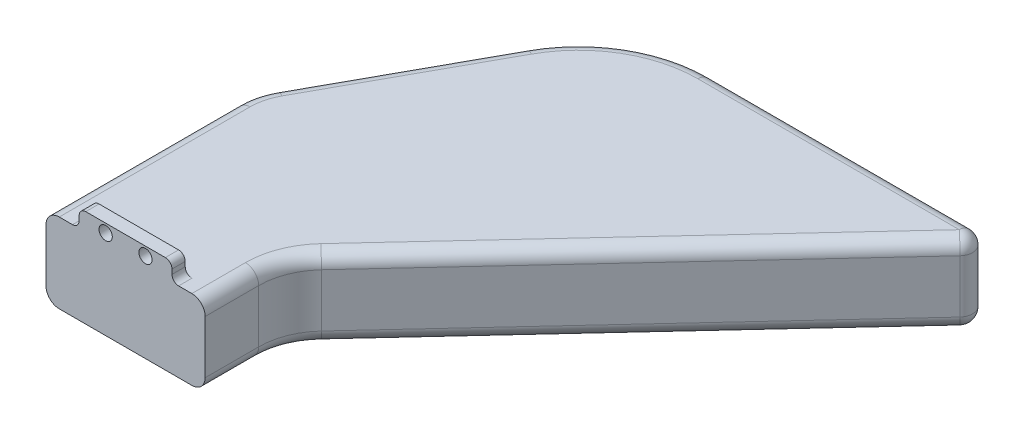
ISO-10303-21;
HEADER;
FILE_DESCRIPTION(('STEP AP214'),'2;1');
FILE_NAME('part.step','',(''),(''),'','','');
FILE_SCHEMA(('AUTOMOTIVE_DESIGN { 1 0 10303 214 1 1 1 1 }'));
ENDSEC;
DATA;
#1=APPLICATION_CONTEXT('core data for automotive mechanical design processes');
#2=APPLICATION_PROTOCOL_DEFINITION('international standard','automotive_design',2000,#1);
#3=PRODUCT_CONTEXT('',#1,'mechanical');
#4=PRODUCT('Part','Part','',(#3));
#5=PRODUCT_RELATED_PRODUCT_CATEGORY('part','',(#4));
#6=PRODUCT_DEFINITION_FORMATION('','',#4);
#7=PRODUCT_DEFINITION_CONTEXT('part definition',#1,'design');
#8=PRODUCT_DEFINITION('design','',#6,#7);
#9=PRODUCT_DEFINITION_SHAPE('','',#8);
#10=(LENGTH_UNIT() NAMED_UNIT(*) SI_UNIT(.MILLI.,.METRE.));
#11=(NAMED_UNIT(*) PLANE_ANGLE_UNIT() SI_UNIT($,.RADIAN.));
#12=(NAMED_UNIT(*) SI_UNIT($,.STERADIAN.) SOLID_ANGLE_UNIT());
#13=UNCERTAINTY_MEASURE_WITH_UNIT(LENGTH_MEASURE(1.E-05),#10,'distance_accuracy_value','');
#14=(GEOMETRIC_REPRESENTATION_CONTEXT(3) GLOBAL_UNCERTAINTY_ASSIGNED_CONTEXT((#13)) GLOBAL_UNIT_ASSIGNED_CONTEXT((#10,
#11,#12)) REPRESENTATION_CONTEXT('',''));
#15=CARTESIAN_POINT('',(0.,0.,0.));
#16=DIRECTION('',(0.,0.,1.));
#17=DIRECTION('',(1.,0.,0.));
#18=AXIS2_PLACEMENT_3D('',#15,#16,#17);
#19=CARTESIAN_POINT('',(4.05099434095391,6.,-18.1082033154485));
#20=DIRECTION('',(0.,-1.,0.));
#21=DIRECTION('',(0.,0.,-1.));
#22=AXIS2_PLACEMENT_3D('',#19,#20,#21);
#23=CYLINDRICAL_SURFACE('',#22,10.);
#24=DIRECTION('',(0.,-1.,0.));
#25=VECTOR('',#24,1.);
#26=CARTESIAN_POINT('',(4.05099434095391,6.,-28.1082033154485));
#27=LINE('',#26,#25);
#28=CARTESIAN_POINT('',(4.05099434095391,5.,-28.1082033154485));
#29=VERTEX_POINT('',#28);
#30=CARTESIAN_POINT('',(4.05099434095391,1.,-28.1082033154485));
#31=VERTEX_POINT('',#30);
#32=EDGE_CURVE('E229',#29,#31,#27,.T.);
#33=ORIENTED_EDGE('',*,*,#32,.T.);
#34=CARTESIAN_POINT('',(4.05099434095391,1.,-18.1082033154485));
#35=DIRECTION('',(0.,1.,0.));
#36=DIRECTION('',(0.,0.,1.));
#37=AXIS2_PLACEMENT_3D('',#34,#35,#36);
#38=CIRCLE('',#37,10.);
#39=CARTESIAN_POINT('',(-4.71242206550166,1.,-22.9251040708166));
#40=VERTEX_POINT('',#39);
#41=EDGE_CURVE('E304',#31,#40,#38,.T.);
#42=ORIENTED_EDGE('',*,*,#41,.T.);
#43=DIRECTION('',(0.,-1.,0.));
#44=VECTOR('',#43,1.);
#45=CARTESIAN_POINT('',(-4.71242206550166,6.,-22.9251040708166));
#46=LINE('',#45,#44);
#47=CARTESIAN_POINT('',(-4.71242206550166,5.,-22.9251040708166));
#48=VERTEX_POINT('',#47);
#49=EDGE_CURVE('E219',#48,#40,#46,.T.);
#50=ORIENTED_EDGE('',*,*,#49,.F.);
#51=CARTESIAN_POINT('',(4.05099434095391,5.,-18.1082033154485));
#52=DIRECTION('',(0.,1.,0.));
#53=DIRECTION('',(0.,0.,1.));
#54=AXIS2_PLACEMENT_3D('',#51,#52,#53);
#55=CIRCLE('',#54,10.);
#56=EDGE_CURVE('E252',#48,#29,#55,.F.);
#57=ORIENTED_EDGE('',*,*,#56,.T.);
#58=EDGE_LOOP('',(#33,#42,#50,#57));
#59=FACE_BOUND('',#58,.T.);
#60=ADVANCED_FACE('F33',(#59),#23,.T.);
#61=CARTESIAN_POINT('',(-11.3817082032278,6.,-10.7916318389956));
#62=DIRECTION('',(0.876341640645557,0.,0.481690075536806));
#63=DIRECTION('',(0.481690075536806,0.,-0.876341640645557));
#64=AXIS2_PLACEMENT_3D('',#61,#62,#63);
#65=PLANE('',#64);
#66=ORIENTED_EDGE('',*,*,#49,.T.);
#67=DIRECTION('',(-0.481690075536806,0.,0.876341640645557));
#68=VECTOR('',#67,1.);
#69=CARTESIAN_POINT('',(-11.3817082032278,1.,-10.7916318389956));
#70=LINE('',#69,#68);
#71=CARTESIAN_POINT('',(-11.3817082032278,1.,-10.7916318389956));
#72=VERTEX_POINT('',#71);
#73=EDGE_CURVE('E302',#40,#72,#70,.T.);
#74=ORIENTED_EDGE('',*,*,#73,.T.);
#75=DIRECTION('',(0.,-1.,0.));
#76=VECTOR('',#75,1.);
#77=CARTESIAN_POINT('',(-11.3817082032278,6.,-10.7916318389956));
#78=LINE('',#77,#76);
#79=CARTESIAN_POINT('',(-11.3817082032278,5.,-10.7916318389956));
#80=VERTEX_POINT('',#79);
#81=EDGE_CURVE('E432',#80,#72,#78,.T.);
#82=ORIENTED_EDGE('',*,*,#81,.F.);
#83=DIRECTION('',(-0.481690075536806,0.,0.876341640645557));
#84=VECTOR('',#83,1.);
#85=CARTESIAN_POINT('',(-4.71242206550166,5.,-22.9251040708166));
#86=LINE('',#85,#84);
#87=EDGE_CURVE('E254',#80,#48,#86,.F.);
#88=ORIENTED_EDGE('',*,*,#87,.T.);
#89=EDGE_LOOP('',(#66,#74,#82,#88));
#90=FACE_BOUND('',#89,.T.);
#91=ADVANCED_FACE('F515',(#90),#65,.F.);
#92=CARTESIAN_POINT('',(-7.,6.,-8.38318146131155));
#93=DIRECTION('',(0.,-1.,0.));
#94=DIRECTION('',(0.,0.,-1.));
#95=AXIS2_PLACEMENT_3D('',#92,#93,#94);
#96=CYLINDRICAL_SURFACE('',#95,5.);
#97=ORIENTED_EDGE('',*,*,#81,.T.);
#98=CARTESIAN_POINT('',(-7.,1.,-8.38318146131155));
#99=DIRECTION('',(0.,1.,0.));
#100=DIRECTION('',(0.,0.,1.));
#101=AXIS2_PLACEMENT_3D('',#98,#99,#100);
#102=CIRCLE('',#101,5.);
#103=CARTESIAN_POINT('',(-12.,1.,-8.38318146131155));
#104=VERTEX_POINT('',#103);
#105=EDGE_CURVE('E259',#72,#104,#102,.T.);
#106=ORIENTED_EDGE('',*,*,#105,.T.);
#107=DIRECTION('',(0.,-1.,0.));
#108=VECTOR('',#107,1.);
#109=CARTESIAN_POINT('',(-12.,6.,-8.38318146131155));
#110=LINE('',#109,#108);
#111=CARTESIAN_POINT('',(-12.,5.,-8.38318146131155));
#112=VERTEX_POINT('',#111);
#113=EDGE_CURVE('E429',#112,#104,#110,.T.);
#114=ORIENTED_EDGE('',*,*,#113,.F.);
#115=CARTESIAN_POINT('',(-7.,5.,-8.38318146131155));
#116=DIRECTION('',(0.,1.,0.));
#117=DIRECTION('',(0.,0.,1.));
#118=AXIS2_PLACEMENT_3D('',#115,#116,#117);
#119=CIRCLE('',#118,5.);
#120=EDGE_CURVE('E256',#112,#80,#119,.F.);
#121=ORIENTED_EDGE('',*,*,#120,.T.);
#122=EDGE_LOOP('',(#97,#106,#114,#121));
#123=FACE_BOUND('',#122,.T.);
#124=ADVANCED_FACE('F512',(#123),#96,.T.);
#125=CARTESIAN_POINT('',(-12.,6.,-8.38318146131155));
#126=DIRECTION('',(1.,0.,0.));
#127=DIRECTION('',(0.,0.,-1.));
#128=AXIS2_PLACEMENT_3D('',#125,#126,#127);
#129=PLANE('',#128);
#130=ORIENTED_EDGE('',*,*,#113,.T.);
#131=DIRECTION('',(0.,0.,1.));
#132=VECTOR('',#131,1.);
#133=CARTESIAN_POINT('',(-12.,1.,-8.38318146131155));
#134=LINE('',#133,#132);
#135=CARTESIAN_POINT('',(-12.,1.,6.));
#136=VERTEX_POINT('',#135);
#137=EDGE_CURVE('E314',#104,#136,#134,.T.);
#138=ORIENTED_EDGE('',*,*,#137,.T.);
#139=DIRECTION('',(0.,-1.,0.));
#140=VECTOR('',#139,1.);
#141=CARTESIAN_POINT('',(-12.,6.,6.));
#142=LINE('',#141,#140);
#143=CARTESIAN_POINT('',(-12.,5.,6.));
#144=VERTEX_POINT('',#143);
#145=EDGE_CURVE('E427',#144,#136,#142,.T.);
#146=ORIENTED_EDGE('',*,*,#145,.F.);
#147=DIRECTION('',(0.,0.,1.));
#148=VECTOR('',#147,1.);
#149=CARTESIAN_POINT('',(-12.,5.,-8.38318146131155));
#150=LINE('',#149,#148);
#151=EDGE_CURVE('E234',#144,#112,#150,.F.);
#152=ORIENTED_EDGE('',*,*,#151,.T.);
#153=EDGE_LOOP('',(#130,#138,#146,#152));
#154=FACE_BOUND('',#153,.T.);
#155=ADVANCED_FACE('F529',(#154),#129,.F.);
#156=CARTESIAN_POINT('',(-12.,6.,6.));
#157=DIRECTION('',(0.,0.,-1.));
#158=DIRECTION('',(-1.,0.,0.));
#159=AXIS2_PLACEMENT_3D('',#156,#157,#158);
#160=PLANE('',#159);
#161=CARTESIAN_POINT('',(-4.5,6.7,6.));
#162=DIRECTION('',(0.,0.,-1.));
#163=DIRECTION('',(1.,0.,0.));
#164=AXIS2_PLACEMENT_3D('',#161,#162,#163);
#165=CIRCLE('',#164,0.500000000000002);
#166=CARTESIAN_POINT('',(-4.,6.7,6.));
#167=VERTEX_POINT('',#166);
#168=EDGE_CURVE('E844',#167,#167,#165,.T.);
#169=ORIENTED_EDGE('',*,*,#168,.T.);
#170=EDGE_LOOP('',(#169));
#171=FACE_BOUND('',#170,.T.);
#172=CARTESIAN_POINT('',(-7.5,6.7,6.));
#173=DIRECTION('',(0.,0.,-1.));
#174=DIRECTION('',(-1.,0.,0.));
#175=AXIS2_PLACEMENT_3D('',#172,#173,#174);
#176=CIRCLE('',#175,0.500000000000003);
#177=CARTESIAN_POINT('',(-8.,6.7,6.));
#178=VERTEX_POINT('',#177);
#179=EDGE_CURVE('E387',#178,#178,#176,.T.);
#180=ORIENTED_EDGE('',*,*,#179,.T.);
#181=EDGE_LOOP('',(#180));
#182=FACE_BOUND('',#181,.T.);
#183=DIRECTION('',(-1.,0.,0.));
#184=VECTOR('',#183,1.);
#185=CARTESIAN_POINT('',(-9.5,7.35,6.));
#186=LINE('',#185,#184);
#187=CARTESIAN_POINT('',(-3.,7.35,6.));
#188=VERTEX_POINT('',#187);
#189=CARTESIAN_POINT('',(-9.,7.35,6.));
#190=VERTEX_POINT('',#189);
#191=EDGE_CURVE('E386',#188,#190,#186,.T.);
#192=ORIENTED_EDGE('',*,*,#191,.T.);
#193=CARTESIAN_POINT('',(-9.,6.85,6.));
#194=DIRECTION('',(0.,0.,-1.));
#195=DIRECTION('',(-1.,0.,0.));
#196=AXIS2_PLACEMENT_3D('',#193,#194,#195);
#197=CIRCLE('',#196,0.5);
#198=CARTESIAN_POINT('',(-9.5,6.85,6.));
#199=VERTEX_POINT('',#198);
#200=EDGE_CURVE('E352',#190,#199,#197,.F.);
#201=ORIENTED_EDGE('',*,*,#200,.T.);
#202=DIRECTION('',(0.,-1.,0.));
#203=VECTOR('',#202,1.);
#204=CARTESIAN_POINT('',(-9.5,6.,6.));
#205=LINE('',#204,#203);
#206=CARTESIAN_POINT('',(-9.5,6.5,6.));
#207=VERTEX_POINT('',#206);
#208=EDGE_CURVE('E400',#199,#207,#205,.T.);
#209=ORIENTED_EDGE('',*,*,#208,.T.);
#210=CARTESIAN_POINT('',(-10.,6.5,6.));
#211=DIRECTION('',(0.,0.,-1.));
#212=DIRECTION('',(-1.,0.,0.));
#213=AXIS2_PLACEMENT_3D('',#210,#211,#212);
#214=CIRCLE('',#213,0.5);
#215=CARTESIAN_POINT('',(-10.,6.,6.));
#216=VERTEX_POINT('',#215);
#217=EDGE_CURVE('E228',#207,#216,#214,.T.);
#218=ORIENTED_EDGE('',*,*,#217,.T.);
#219=DIRECTION('',(1.,0.,0.));
#220=VECTOR('',#219,1.);
#221=CARTESIAN_POINT('',(-12.,6.,6.));
#222=LINE('',#221,#220);
#223=CARTESIAN_POINT('',(-11.,6.,6.));
#224=VERTEX_POINT('',#223);
#225=EDGE_CURVE('E211',#224,#216,#222,.T.);
#226=ORIENTED_EDGE('',*,*,#225,.F.);
#227=CARTESIAN_POINT('',(-11.,5.,6.));
#228=DIRECTION('',(0.,0.,-1.));
#229=DIRECTION('',(-1.,0.,0.));
#230=AXIS2_PLACEMENT_3D('',#227,#228,#229);
#231=CIRCLE('',#230,1.);
#232=EDGE_CURVE('E225',#224,#144,#231,.F.);
#233=ORIENTED_EDGE('',*,*,#232,.T.);
#234=ORIENTED_EDGE('',*,*,#145,.T.);
#235=CARTESIAN_POINT('',(-11.,1.,6.));
#236=DIRECTION('',(0.,0.,-1.));
#237=DIRECTION('',(-1.,0.,0.));
#238=AXIS2_PLACEMENT_3D('',#235,#236,#237);
#239=CIRCLE('',#238,1.);
#240=CARTESIAN_POINT('',(-11.,0.,6.));
#241=VERTEX_POINT('',#240);
#242=EDGE_CURVE('E318',#136,#241,#239,.F.);
#243=ORIENTED_EDGE('',*,*,#242,.T.);
#244=DIRECTION('',(1.,0.,0.));
#245=VECTOR('',#244,1.);
#246=CARTESIAN_POINT('',(-12.,0.,6.));
#247=LINE('',#246,#245);
#248=CARTESIAN_POINT('',(-1.,0.,6.));
#249=VERTEX_POINT('',#248);
#250=EDGE_CURVE('E283',#241,#249,#247,.T.);
#251=ORIENTED_EDGE('',*,*,#250,.T.);
#252=CARTESIAN_POINT('',(-1.,1.,6.));
#253=DIRECTION('',(0.,0.,-1.));
#254=DIRECTION('',(-1.,0.,0.));
#255=AXIS2_PLACEMENT_3D('',#252,#253,#254);
#256=CIRCLE('',#255,1.);
#257=CARTESIAN_POINT('',(0.,1.,6.));
#258=VERTEX_POINT('',#257);
#259=EDGE_CURVE('E316',#249,#258,#256,.F.);
#260=ORIENTED_EDGE('',*,*,#259,.T.);
#261=DIRECTION('',(0.,-1.,0.));
#262=VECTOR('',#261,1.);
#263=CARTESIAN_POINT('',(0.,6.,6.));
#264=LINE('',#263,#262);
#265=CARTESIAN_POINT('',(0.,5.,6.));
#266=VERTEX_POINT('',#265);
#267=EDGE_CURVE('E424',#266,#258,#264,.T.);
#268=ORIENTED_EDGE('',*,*,#267,.F.);
#269=CARTESIAN_POINT('',(-1.,5.,6.));
#270=DIRECTION('',(0.,0.,-1.));
#271=DIRECTION('',(-1.,0.,0.));
#272=AXIS2_PLACEMENT_3D('',#269,#270,#271);
#273=CIRCLE('',#272,1.);
#274=CARTESIAN_POINT('',(-1.,6.,6.));
#275=VERTEX_POINT('',#274);
#276=EDGE_CURVE('E235',#266,#275,#273,.F.);
#277=ORIENTED_EDGE('',*,*,#276,.T.);
#278=CARTESIAN_POINT('',(-2.,6.,6.));
#279=VERTEX_POINT('',#278);
#280=EDGE_CURVE('E230',#279,#275,#222,.T.);
#281=ORIENTED_EDGE('',*,*,#280,.F.);
#282=CARTESIAN_POINT('',(-2.,6.5,6.));
#283=DIRECTION('',(0.,0.,-1.));
#284=DIRECTION('',(-1.,0.,0.));
#285=AXIS2_PLACEMENT_3D('',#282,#283,#284);
#286=CIRCLE('',#285,0.5);
#287=CARTESIAN_POINT('',(-2.5,6.5,6.));
#288=VERTEX_POINT('',#287);
#289=EDGE_CURVE('E41',#279,#288,#286,.T.);
#290=ORIENTED_EDGE('',*,*,#289,.T.);
#291=DIRECTION('',(0.,1.,0.));
#292=VECTOR('',#291,1.);
#293=CARTESIAN_POINT('',(-2.5,6.,6.));
#294=LINE('',#293,#292);
#295=CARTESIAN_POINT('',(-2.5,6.85,6.));
#296=VERTEX_POINT('',#295);
#297=EDGE_CURVE('E377',#288,#296,#294,.T.);
#298=ORIENTED_EDGE('',*,*,#297,.T.);
#299=CARTESIAN_POINT('',(-3.,6.85,6.));
#300=DIRECTION('',(0.,0.,-1.));
#301=DIRECTION('',(-1.,0.,0.));
#302=AXIS2_PLACEMENT_3D('',#299,#300,#301);
#303=CIRCLE('',#302,0.5);
#304=EDGE_CURVE('E350',#296,#188,#303,.F.);
#305=ORIENTED_EDGE('',*,*,#304,.T.);
#306=EDGE_LOOP('',(#192,#201,#209,#218,#226,#233,#234,#243,#251,#260,#268,#277,#281,#290,#298,#305));
#307=FACE_BOUND('',#306,.T.);
#308=ADVANCED_FACE('F223',(#171,#182,#307),#160,.F.);
#309=CARTESIAN_POINT('',(0.,6.,6.));
#310=DIRECTION('',(-1.,0.,0.));
#311=DIRECTION('',(0.,0.,1.));
#312=AXIS2_PLACEMENT_3D('',#309,#310,#311);
#313=PLANE('',#312);
#314=ORIENTED_EDGE('',*,*,#267,.T.);
#315=DIRECTION('',(0.,0.,-1.));
#316=VECTOR('',#315,1.);
#317=CARTESIAN_POINT('',(0.,1.,6.));
#318=LINE('',#317,#316);
#319=CARTESIAN_POINT('',(0.,1.,1.96099101723557));
#320=VERTEX_POINT('',#319);
#321=EDGE_CURVE('E320',#258,#320,#318,.T.);
#322=ORIENTED_EDGE('',*,*,#321,.T.);
#323=DIRECTION('',(0.,-1.,0.));
#324=VECTOR('',#323,1.);
#325=CARTESIAN_POINT('',(0.,6.,1.96099101723557));
#326=LINE('',#325,#324);
#327=CARTESIAN_POINT('',(0.,5.,1.96099101723557));
#328=VERTEX_POINT('',#327);
#329=EDGE_CURVE('E421',#328,#320,#326,.T.);
#330=ORIENTED_EDGE('',*,*,#329,.F.);
#331=DIRECTION('',(0.,0.,-1.));
#332=VECTOR('',#331,1.);
#333=CARTESIAN_POINT('',(0.,5.,6.));
#334=LINE('',#333,#332);
#335=EDGE_CURVE('E236',#328,#266,#334,.F.);
#336=ORIENTED_EDGE('',*,*,#335,.T.);
#337=EDGE_LOOP('',(#314,#322,#330,#336));
#338=FACE_BOUND('',#337,.T.);
#339=ADVANCED_FACE('F547',(#338),#313,.F.);
#340=CARTESIAN_POINT('',(5.,6.,1.96099101723556));
#341=DIRECTION('',(0.,-1.,0.));
#342=DIRECTION('',(0.,0.,-1.));
#343=AXIS2_PLACEMENT_3D('',#340,#341,#342);
#344=CYLINDRICAL_SURFACE('',#343,5.);
#345=ORIENTED_EDGE('',*,*,#329,.T.);
#346=CARTESIAN_POINT('',(5.,1.,1.96099101723556));
#347=DIRECTION('',(0.,1.,0.));
#348=DIRECTION('',(0.,0.,1.));
#349=AXIS2_PLACEMENT_3D('',#346,#347,#348);
#350=CIRCLE('',#349,5.);
#351=CARTESIAN_POINT('',(1.3331326088191,1.,-1.43813880309996));
#352=VERTEX_POINT('',#351);
#353=EDGE_CURVE('E312',#320,#352,#350,.F.);
#354=ORIENTED_EDGE('',*,*,#353,.T.);
#355=DIRECTION('',(0.,-1.,0.));
#356=VECTOR('',#355,1.);
#357=CARTESIAN_POINT('',(1.3331326088191,6.,-1.43813880309996));
#358=LINE('',#357,#356);
#359=CARTESIAN_POINT('',(1.3331326088191,5.,-1.43813880309996));
#360=VERTEX_POINT('',#359);
#361=EDGE_CURVE('E418',#360,#352,#358,.T.);
#362=ORIENTED_EDGE('',*,*,#361,.F.);
#363=CARTESIAN_POINT('',(5.,5.,1.96099101723556));
#364=DIRECTION('',(0.,1.,0.));
#365=DIRECTION('',(0.,0.,1.));
#366=AXIS2_PLACEMENT_3D('',#363,#364,#365);
#367=CIRCLE('',#366,5.);
#368=EDGE_CURVE('E239',#360,#328,#367,.T.);
#369=ORIENTED_EDGE('',*,*,#368,.T.);
#370=EDGE_LOOP('',(#345,#354,#362,#369));
#371=FACE_BOUND('',#370,.T.);
#372=ADVANCED_FACE('F549',(#371),#344,.F.);
#373=CARTESIAN_POINT('',(24.4987003822981,6.,-26.4283773513814));
#374=DIRECTION('',(-0.733373478236182,0.,-0.679825964067101));
#375=DIRECTION('',(-0.679825964067101,0.,0.733373478236182));
#376=AXIS2_PLACEMENT_3D('',#373,#374,#375);
#377=PLANE('',#376);
#378=ORIENTED_EDGE('',*,*,#361,.T.);
#379=DIRECTION('',(0.679825964067101,0.,-0.733373478236182));
#380=VECTOR('',#379,1.);
#381=CARTESIAN_POINT('',(24.4987003822981,1.,-26.4283773513814));
#382=LINE('',#381,#380);
#383=CARTESIAN_POINT('',(24.4987003822981,1.,-26.4283773513814));
#384=VERTEX_POINT('',#383);
#385=EDGE_CURVE('E310',#352,#384,#382,.T.);
#386=ORIENTED_EDGE('',*,*,#385,.T.);
#387=DIRECTION('',(0.,-1.,0.));
#388=VECTOR('',#387,1.);
#389=CARTESIAN_POINT('',(24.4987003822981,6.,-26.4283773513814));
#390=LINE('',#389,#388);
#391=CARTESIAN_POINT('',(24.4987003822981,5.,-26.4283773513814));
#392=VERTEX_POINT('',#391);
#393=EDGE_CURVE('E415',#392,#384,#390,.T.);
#394=ORIENTED_EDGE('',*,*,#393,.F.);
#395=DIRECTION('',(0.679825964067101,0.,-0.733373478236182));
#396=VECTOR('',#395,1.);
#397=CARTESIAN_POINT('',(1.33313260881911,5.,-1.43813880309997));
#398=LINE('',#397,#396);
#399=EDGE_CURVE('E246',#392,#360,#398,.F.);
#400=ORIENTED_EDGE('',*,*,#399,.T.);
#401=EDGE_LOOP('',(#378,#386,#394,#400));
#402=FACE_BOUND('',#401,.T.);
#403=ADVANCED_FACE('F480',(#402),#377,.F.);
#404=CARTESIAN_POINT('',(23.7653269040619,6.,-27.1082033154485));
#405=DIRECTION('',(0.,-1.,0.));
#406=DIRECTION('',(0.,0.,-1.));
#407=AXIS2_PLACEMENT_3D('',#404,#405,#406);
#408=CYLINDRICAL_SURFACE('',#407,1.);
#409=ORIENTED_EDGE('',*,*,#393,.T.);
#410=CARTESIAN_POINT('',(23.7653269040619,1.,-27.1082033154485));
#411=DIRECTION('',(0.,-1.,0.));
#412=DIRECTION('',(0.,0.,-1.));
#413=AXIS2_PLACEMENT_3D('',#410,#411,#412);
#414=CIRCLE('',#413,1.);
#415=CARTESIAN_POINT('',(23.7653269040619,1.,-28.1082033154485));
#416=VERTEX_POINT('',#415);
#417=EDGE_CURVE('E308',#384,#416,#414,.F.);
#418=ORIENTED_EDGE('',*,*,#417,.T.);
#419=DIRECTION('',(0.,-1.,0.));
#420=VECTOR('',#419,1.);
#421=CARTESIAN_POINT('',(23.7653269040619,6.,-28.1082033154485));
#422=LINE('',#421,#420);
#423=CARTESIAN_POINT('',(23.7653269040619,5.,-28.1082033154485));
#424=VERTEX_POINT('',#423);
#425=EDGE_CURVE('E412',#424,#416,#422,.T.);
#426=ORIENTED_EDGE('',*,*,#425,.F.);
#427=CARTESIAN_POINT('',(23.7653269040619,5.,-27.1082033154485));
#428=DIRECTION('',(0.,-1.,0.));
#429=DIRECTION('',(0.,0.,-1.));
#430=AXIS2_PLACEMENT_3D('',#427,#428,#429);
#431=CIRCLE('',#430,1.);
#432=EDGE_CURVE('E248',#424,#392,#431,.T.);
#433=ORIENTED_EDGE('',*,*,#432,.T.);
#434=EDGE_LOOP('',(#409,#418,#426,#433));
#435=FACE_BOUND('',#434,.T.);
#436=ADVANCED_FACE('F477',(#435),#408,.T.);
#437=CARTESIAN_POINT('',(4.05099434095391,6.,-28.1082033154485));
#438=DIRECTION('',(0.,0.,1.));
#439=DIRECTION('',(1.,0.,0.));
#440=AXIS2_PLACEMENT_3D('',#437,#438,#439);
#441=PLANE('',#440);
#442=ORIENTED_EDGE('',*,*,#425,.T.);
#443=DIRECTION('',(-1.,0.,0.));
#444=VECTOR('',#443,1.);
#445=CARTESIAN_POINT('',(4.05099434095391,1.,-28.1082033154485));
#446=LINE('',#445,#444);
#447=EDGE_CURVE('E306',#416,#31,#446,.T.);
#448=ORIENTED_EDGE('',*,*,#447,.T.);
#449=ORIENTED_EDGE('',*,*,#32,.F.);
#450=DIRECTION('',(-1.,0.,0.));
#451=VECTOR('',#450,1.);
#452=CARTESIAN_POINT('',(23.7653269040619,5.,-28.1082033154485));
#453=LINE('',#452,#451);
#454=EDGE_CURVE('E250',#29,#424,#453,.F.);
#455=ORIENTED_EDGE('',*,*,#454,.T.);
#456=EDGE_LOOP('',(#442,#448,#449,#455));
#457=FACE_BOUND('',#456,.T.);
#458=ADVANCED_FACE('F493',(#457),#441,.F.);
#459=CARTESIAN_POINT('',(4.05099434095391,6.,-18.1082033154485));
#460=DIRECTION('',(0.,1.,0.));
#461=DIRECTION('',(0.,0.,1.));
#462=AXIS2_PLACEMENT_3D('',#459,#460,#461);
#463=PLANE('',#462);
#464=ORIENTED_EDGE('',*,*,#225,.T.);
#465=DIRECTION('',(0.,0.,1.));
#466=VECTOR('',#465,1.);
#467=CARTESIAN_POINT('',(-10.,6.,5.));
#468=LINE('',#467,#466);
#469=CARTESIAN_POINT('',(-10.,6.,5.));
#470=VERTEX_POINT('',#469);
#471=EDGE_CURVE('E365',#216,#470,#468,.F.);
#472=ORIENTED_EDGE('',*,*,#471,.T.);
#473=DIRECTION('',(1.,0.,0.));
#474=VECTOR('',#473,1.);
#475=CARTESIAN_POINT('',(-9.5,6.,5.));
#476=LINE('',#475,#474);
#477=CARTESIAN_POINT('',(-2.,6.,5.));
#478=VERTEX_POINT('',#477);
#479=EDGE_CURVE('E47',#470,#478,#476,.T.);
#480=ORIENTED_EDGE('',*,*,#479,.T.);
#481=DIRECTION('',(0.,0.,1.));
#482=VECTOR('',#481,1.);
#483=CARTESIAN_POINT('',(-2.,6.,6.));
#484=LINE('',#483,#482);
#485=EDGE_CURVE('E363',#478,#279,#484,.T.);
#486=ORIENTED_EDGE('',*,*,#485,.T.);
#487=ORIENTED_EDGE('',*,*,#280,.T.);
#488=DIRECTION('',(0.,0.,-1.));
#489=VECTOR('',#488,1.);
#490=CARTESIAN_POINT('',(-1.,6.,1.96099101723558));
#491=LINE('',#490,#489);
#492=CARTESIAN_POINT('',(-1.,6.,1.96099101723557));
#493=VERTEX_POINT('',#492);
#494=EDGE_CURVE('E241',#275,#493,#491,.T.);
#495=ORIENTED_EDGE('',*,*,#494,.T.);
#496=CARTESIAN_POINT('',(5.,6.,1.96099101723556));
#497=DIRECTION('',(0.,1.,0.));
#498=DIRECTION('',(0.,0.,1.));
#499=AXIS2_PLACEMENT_3D('',#496,#497,#498);
#500=CIRCLE('',#499,6.);
#501=CARTESIAN_POINT('',(0.599759130582923,6.,-2.11796476716707));
#502=VERTEX_POINT('',#501);
#503=EDGE_CURVE('E446',#493,#502,#500,.F.);
#504=ORIENTED_EDGE('',*,*,#503,.T.);
#505=DIRECTION('',(0.679825964067101,0.,-0.733373478236182));
#506=VECTOR('',#505,1.);
#507=CARTESIAN_POINT('',(23.7653269040619,6.,-27.1082033154485));
#508=LINE('',#507,#506);
#509=CARTESIAN_POINT('',(23.7653269040619,6.,-27.1082033154485));
#510=VERTEX_POINT('',#509);
#511=EDGE_CURVE('E444',#502,#510,#508,.T.);
#512=ORIENTED_EDGE('',*,*,#511,.T.);
#513=DIRECTION('',(-1.,0.,0.));
#514=VECTOR('',#513,1.);
#515=CARTESIAN_POINT('',(4.05099434095391,6.,-27.1082033154485));
#516=LINE('',#515,#514);
#517=CARTESIAN_POINT('',(4.05099434095391,6.,-27.1082033154485));
#518=VERTEX_POINT('',#517);
#519=EDGE_CURVE('E442',#510,#518,#516,.T.);
#520=ORIENTED_EDGE('',*,*,#519,.T.);
#521=CARTESIAN_POINT('',(4.05099434095391,6.,-18.1082033154485));
#522=DIRECTION('',(0.,1.,0.));
#523=DIRECTION('',(0.,0.,1.));
#524=AXIS2_PLACEMENT_3D('',#521,#522,#523);
#525=CIRCLE('',#524,9.);
#526=CARTESIAN_POINT('',(-3.83608042485611,6.,-22.4434139952797));
#527=VERTEX_POINT('',#526);
#528=EDGE_CURVE('E440',#518,#527,#525,.T.);
#529=ORIENTED_EDGE('',*,*,#528,.T.);
#530=DIRECTION('',(-0.481690075536806,0.,0.876341640645557));
#531=VECTOR('',#530,1.);
#532=CARTESIAN_POINT('',(-10.5053665625822,6.,-10.3099417634588));
#533=LINE('',#532,#531);
#534=CARTESIAN_POINT('',(-10.5053665625822,6.,-10.3099417634588));
#535=VERTEX_POINT('',#534);
#536=EDGE_CURVE('E438',#527,#535,#533,.T.);
#537=ORIENTED_EDGE('',*,*,#536,.T.);
#538=CARTESIAN_POINT('',(-7.,6.,-8.38318146131155));
#539=DIRECTION('',(0.,1.,0.));
#540=DIRECTION('',(0.,0.,1.));
#541=AXIS2_PLACEMENT_3D('',#538,#539,#540);
#542=CIRCLE('',#541,4.);
#543=CARTESIAN_POINT('',(-11.,6.,-8.38318146131155));
#544=VERTEX_POINT('',#543);
#545=EDGE_CURVE('E214',#535,#544,#542,.T.);
#546=ORIENTED_EDGE('',*,*,#545,.T.);
#547=DIRECTION('',(0.,0.,1.));
#548=VECTOR('',#547,1.);
#549=CARTESIAN_POINT('',(-11.,6.,6.));
#550=LINE('',#549,#548);
#551=EDGE_CURVE('E208',#544,#224,#550,.T.);
#552=ORIENTED_EDGE('',*,*,#551,.T.);
#553=EDGE_LOOP('',(#464,#472,#480,#486,#487,#495,#504,#512,#520,#529,#537,#546,#552));
#554=FACE_BOUND('',#553,.T.);
#555=ADVANCED_FACE('F210',(#554),#463,.T.);
#556=CARTESIAN_POINT('',(4.05099434095391,0.,-18.1082033154485));
#557=DIRECTION('',(0.,1.,0.));
#558=DIRECTION('',(0.,0.,1.));
#559=AXIS2_PLACEMENT_3D('',#556,#557,#558);
#560=PLANE('',#559);
#561=ORIENTED_EDGE('',*,*,#250,.F.);
#562=DIRECTION('',(0.,0.,1.));
#563=VECTOR('',#562,1.);
#564=CARTESIAN_POINT('',(-11.,0.,-18.1082033154485));
#565=LINE('',#564,#563);
#566=CARTESIAN_POINT('',(-11.,0.,-8.38318146131155));
#567=VERTEX_POINT('',#566);
#568=EDGE_CURVE('E300',#241,#567,#565,.F.);
#569=ORIENTED_EDGE('',*,*,#568,.T.);
#570=CARTESIAN_POINT('',(-7.,0.,-8.38318146131155));
#571=DIRECTION('',(0.,1.,0.));
#572=DIRECTION('',(0.,0.,1.));
#573=AXIS2_PLACEMENT_3D('',#570,#571,#572);
#574=CIRCLE('',#573,4.);
#575=CARTESIAN_POINT('',(-10.5053665625822,0.,-10.3099417634588));
#576=VERTEX_POINT('',#575);
#577=EDGE_CURVE('E298',#567,#576,#574,.F.);
#578=ORIENTED_EDGE('',*,*,#577,.T.);
#579=DIRECTION('',(-0.481690075536806,0.,0.876341640645557));
#580=VECTOR('',#579,1.);
#581=CARTESIAN_POINT('',(-3.83608042485611,0.,-22.4434139952798));
#582=LINE('',#581,#580);
#583=CARTESIAN_POINT('',(-3.83608042485611,0.,-22.4434139952797));
#584=VERTEX_POINT('',#583);
#585=EDGE_CURVE('E296',#576,#584,#582,.F.);
#586=ORIENTED_EDGE('',*,*,#585,.T.);
#587=CARTESIAN_POINT('',(4.05099434095391,0.,-18.1082033154485));
#588=DIRECTION('',(0.,1.,0.));
#589=DIRECTION('',(0.,0.,1.));
#590=AXIS2_PLACEMENT_3D('',#587,#588,#589);
#591=CIRCLE('',#590,9.);
#592=CARTESIAN_POINT('',(4.05099434095391,0.,-27.1082033154485));
#593=VERTEX_POINT('',#592);
#594=EDGE_CURVE('E294',#584,#593,#591,.F.);
#595=ORIENTED_EDGE('',*,*,#594,.T.);
#596=DIRECTION('',(-1.,0.,0.));
#597=VECTOR('',#596,1.);
#598=CARTESIAN_POINT('',(4.0509943409539,0.,-27.1082033154485));
#599=LINE('',#598,#597);
#600=CARTESIAN_POINT('',(23.7653269040619,0.,-27.1082033154485));
#601=VERTEX_POINT('',#600);
#602=EDGE_CURVE('E292',#593,#601,#599,.F.);
#603=ORIENTED_EDGE('',*,*,#602,.T.);
#604=DIRECTION('',(0.679825964067101,0.,-0.733373478236182));
#605=VECTOR('',#604,1.);
#606=CARTESIAN_POINT('',(10.166988106067,0.,-12.4387709171073));
#607=LINE('',#606,#605);
#608=CARTESIAN_POINT('',(0.59975913058292,0.,-2.11796476716707));
#609=VERTEX_POINT('',#608);
#610=EDGE_CURVE('E290',#601,#609,#607,.F.);
#611=ORIENTED_EDGE('',*,*,#610,.T.);
#612=CARTESIAN_POINT('',(5.,0.,1.96099101723556));
#613=DIRECTION('',(0.,1.,0.));
#614=DIRECTION('',(0.,0.,1.));
#615=AXIS2_PLACEMENT_3D('',#612,#613,#614);
#616=CIRCLE('',#615,6.);
#617=CARTESIAN_POINT('',(-1.,0.,1.96099101723558));
#618=VERTEX_POINT('',#617);
#619=EDGE_CURVE('E288',#609,#618,#616,.T.);
#620=ORIENTED_EDGE('',*,*,#619,.T.);
#621=DIRECTION('',(0.,0.,-1.));
#622=VECTOR('',#621,1.);
#623=CARTESIAN_POINT('',(-1.,0.,-18.1082033154485));
#624=LINE('',#623,#622);
#625=EDGE_CURVE('E286',#618,#249,#624,.F.);
#626=ORIENTED_EDGE('',*,*,#625,.T.);
#627=EDGE_LOOP('',(#561,#569,#578,#586,#595,#603,#611,#620,#626));
#628=FACE_BOUND('',#627,.T.);
#629=ADVANCED_FACE('F536',(#628),#560,.F.);
#630=CARTESIAN_POINT('',(-11.,5.,-18.1082033154485));
#631=DIRECTION('',(0.,0.,-1.));
#632=DIRECTION('',(-1.,0.,0.));
#633=AXIS2_PLACEMENT_3D('',#630,#631,#632);
#634=CYLINDRICAL_SURFACE('',#633,1.);
#635=ORIENTED_EDGE('',*,*,#232,.F.);
#636=ORIENTED_EDGE('',*,*,#551,.F.);
#637=CARTESIAN_POINT('',(-11.,5.,-8.38318146131155));
#638=DIRECTION('',(0.,0.,-1.));
#639=DIRECTION('',(-1.,0.,0.));
#640=AXIS2_PLACEMENT_3D('',#637,#638,#639);
#641=CIRCLE('',#640,1.);
#642=EDGE_CURVE('E281',#112,#544,#641,.T.);
#643=ORIENTED_EDGE('',*,*,#642,.F.);
#644=ORIENTED_EDGE('',*,*,#151,.F.);
#645=EDGE_LOOP('',(#635,#636,#643,#644));
#646=FACE_BOUND('',#645,.T.);
#647=ADVANCED_FACE('F233',(#646),#634,.T.);
#648=CARTESIAN_POINT('',(-7.,5.,-8.38318146131155));
#649=DIRECTION('',(0.,1.,0.));
#650=DIRECTION('',(0.,0.,1.));
#651=AXIS2_PLACEMENT_3D('',#648,#649,#650);
#652=TOROIDAL_SURFACE('',#651,4.,1.);
#653=ORIENTED_EDGE('',*,*,#642,.T.);
#654=ORIENTED_EDGE('',*,*,#545,.F.);
#655=CARTESIAN_POINT('',(-10.5053665625822,5.,-10.3099417634588));
#656=DIRECTION('',(0.481690075536806,0.,-0.876341640645557));
#657=DIRECTION('',(-0.876341640645557,0.,-0.481690075536806));
#658=AXIS2_PLACEMENT_3D('',#655,#656,#657);
#659=CIRCLE('',#658,1.);
#660=EDGE_CURVE('E278',#80,#535,#659,.T.);
#661=ORIENTED_EDGE('',*,*,#660,.F.);
#662=ORIENTED_EDGE('',*,*,#120,.F.);
#663=EDGE_LOOP('',(#653,#654,#661,#662));
#664=FACE_BOUND('',#663,.T.);
#665=ADVANCED_FACE('F508',(#664),#652,.T.);
#666=CARTESIAN_POINT('',(-3.83608042485611,5.,-22.4434139952798));
#667=DIRECTION('',(0.481690075536806,0.,-0.876341640645557));
#668=DIRECTION('',(-0.876341640645557,0.,-0.481690075536806));
#669=AXIS2_PLACEMENT_3D('',#666,#667,#668);
#670=CYLINDRICAL_SURFACE('',#669,1.);
#671=ORIENTED_EDGE('',*,*,#660,.T.);
#672=ORIENTED_EDGE('',*,*,#536,.F.);
#673=CARTESIAN_POINT('',(-3.8360804248561,5.,-22.4434139952797));
#674=DIRECTION('',(0.481690075536806,0.,-0.876341640645557));
#675=DIRECTION('',(-0.876341640645557,0.,-0.481690075536806));
#676=AXIS2_PLACEMENT_3D('',#673,#674,#675);
#677=CIRCLE('',#676,1.);
#678=EDGE_CURVE('E275',#48,#527,#677,.T.);
#679=ORIENTED_EDGE('',*,*,#678,.F.);
#680=ORIENTED_EDGE('',*,*,#87,.F.);
#681=EDGE_LOOP('',(#671,#672,#679,#680));
#682=FACE_BOUND('',#681,.T.);
#683=ADVANCED_FACE('F503',(#682),#670,.T.);
#684=CARTESIAN_POINT('',(4.05099434095391,5.,-18.1082033154485));
#685=DIRECTION('',(0.,1.,0.));
#686=DIRECTION('',(0.,0.,1.));
#687=AXIS2_PLACEMENT_3D('',#684,#685,#686);
#688=TOROIDAL_SURFACE('',#687,9.,1.);
#689=ORIENTED_EDGE('',*,*,#678,.T.);
#690=ORIENTED_EDGE('',*,*,#528,.F.);
#691=CARTESIAN_POINT('',(4.05099434095391,5.,-27.1082033154485));
#692=DIRECTION('',(1.,0.,0.));
#693=DIRECTION('',(0.,0.,-1.));
#694=AXIS2_PLACEMENT_3D('',#691,#692,#693);
#695=CIRCLE('',#694,1.);
#696=EDGE_CURVE('E272',#29,#518,#695,.T.);
#697=ORIENTED_EDGE('',*,*,#696,.F.);
#698=ORIENTED_EDGE('',*,*,#56,.F.);
#699=EDGE_LOOP('',(#689,#690,#697,#698));
#700=FACE_BOUND('',#699,.T.);
#701=ADVANCED_FACE('F499',(#700),#688,.T.);
#702=CARTESIAN_POINT('',(4.0509943409539,5.,-27.1082033154485));
#703=DIRECTION('',(1.,0.,0.));
#704=DIRECTION('',(0.,0.,-1.));
#705=AXIS2_PLACEMENT_3D('',#702,#703,#704);
#706=CYLINDRICAL_SURFACE('',#705,1.);
#707=CARTESIAN_POINT('',(23.7653269040619,5.,-27.1082033154485));
#708=DIRECTION('',(1.,0.,0.));
#709=DIRECTION('',(0.,0.,-1.));
#710=AXIS2_PLACEMENT_3D('',#707,#708,#709);
#711=CIRCLE('',#710,1.);
#712=EDGE_CURVE('E269',#424,#510,#711,.T.);
#713=ORIENTED_EDGE('',*,*,#712,.F.);
#714=ORIENTED_EDGE('',*,*,#454,.F.);
#715=ORIENTED_EDGE('',*,*,#696,.T.);
#716=ORIENTED_EDGE('',*,*,#519,.F.);
#717=EDGE_LOOP('',(#713,#714,#715,#716));
#718=FACE_BOUND('',#717,.T.);
#719=ADVANCED_FACE('F468',(#718),#706,.T.);
#720=CARTESIAN_POINT('',(23.7653269040619,5.,-27.1082033154485));
#721=DIRECTION('',(0.,0.,1.));
#722=DIRECTION('',(1.,0.,0.));
#723=AXIS2_PLACEMENT_3D('',#720,#721,#722);
#724=SPHERICAL_SURFACE('',#723,1.);
#725=ORIENTED_EDGE('',*,*,#432,.F.);
#726=ORIENTED_EDGE('',*,*,#712,.T.);
#727=CARTESIAN_POINT('',(23.7653269040619,5.,-27.1082033154485));
#728=DIRECTION('',(-0.679825964067102,0.,0.733373478236182));
#729=DIRECTION('',(0.733373478236182,0.,0.679825964067102));
#730=AXIS2_PLACEMENT_3D('',#727,#728,#729);
#731=CIRCLE('',#730,1.);
#732=EDGE_CURVE('E266',#392,#510,#731,.T.);
#733=ORIENTED_EDGE('',*,*,#732,.F.);
#734=EDGE_LOOP('',(#725,#726,#733));
#735=FACE_BOUND('',#734,.T.);
#736=ADVANCED_FACE('F473',(#735),#724,.T.);
#737=CARTESIAN_POINT('',(10.166988106067,5.,-12.4387709171073));
#738=DIRECTION('',(-0.679825964067101,0.,0.733373478236182));
#739=DIRECTION('',(0.733373478236182,0.,0.679825964067101));
#740=AXIS2_PLACEMENT_3D('',#737,#738,#739);
#741=CYLINDRICAL_SURFACE('',#740,1.);
#742=ORIENTED_EDGE('',*,*,#732,.T.);
#743=ORIENTED_EDGE('',*,*,#511,.F.);
#744=CARTESIAN_POINT('',(0.59975913058292,5.,-2.11796476716707));
#745=DIRECTION('',(-0.679825964067101,0.,0.733373478236182));
#746=DIRECTION('',(0.733373478236182,0.,0.679825964067101));
#747=AXIS2_PLACEMENT_3D('',#744,#745,#746);
#748=CIRCLE('',#747,1.);
#749=EDGE_CURVE('E262',#360,#502,#748,.T.);
#750=ORIENTED_EDGE('',*,*,#749,.F.);
#751=ORIENTED_EDGE('',*,*,#399,.F.);
#752=EDGE_LOOP('',(#742,#743,#750,#751));
#753=FACE_BOUND('',#752,.T.);
#754=ADVANCED_FACE('F462',(#753),#741,.T.);
#755=CARTESIAN_POINT('',(5.,5.,1.96099101723556));
#756=DIRECTION('',(0.,1.,0.));
#757=DIRECTION('',(0.,0.,1.));
#758=AXIS2_PLACEMENT_3D('',#755,#756,#757);
#759=TOROIDAL_SURFACE('',#758,6.,1.);
#760=ORIENTED_EDGE('',*,*,#749,.T.);
#761=ORIENTED_EDGE('',*,*,#503,.F.);
#762=CARTESIAN_POINT('',(-1.,5.,1.96099101723558));
#763=DIRECTION('',(0.,0.,1.));
#764=DIRECTION('',(1.,0.,0.));
#765=AXIS2_PLACEMENT_3D('',#762,#763,#764);
#766=CIRCLE('',#765,1.);
#767=EDGE_CURVE('E260',#328,#493,#766,.T.);
#768=ORIENTED_EDGE('',*,*,#767,.F.);
#769=ORIENTED_EDGE('',*,*,#368,.F.);
#770=EDGE_LOOP('',(#760,#761,#768,#769));
#771=FACE_BOUND('',#770,.T.);
#772=ADVANCED_FACE('F458',(#771),#759,.T.);
#773=CARTESIAN_POINT('',(-1.,5.,-18.1082033154485));
#774=DIRECTION('',(0.,0.,1.));
#775=DIRECTION('',(1.,0.,0.));
#776=AXIS2_PLACEMENT_3D('',#773,#774,#775);
#777=CYLINDRICAL_SURFACE('',#776,1.);
#778=ORIENTED_EDGE('',*,*,#276,.F.);
#779=ORIENTED_EDGE('',*,*,#335,.F.);
#780=ORIENTED_EDGE('',*,*,#767,.T.);
#781=ORIENTED_EDGE('',*,*,#494,.F.);
#782=EDGE_LOOP('',(#778,#779,#780,#781));
#783=FACE_BOUND('',#782,.T.);
#784=ADVANCED_FACE('F453',(#783),#777,.T.);
#785=CARTESIAN_POINT('',(-1.,1.,6.));
#786=DIRECTION('',(0.,0.,-1.));
#787=DIRECTION('',(-1.,0.,0.));
#788=AXIS2_PLACEMENT_3D('',#785,#786,#787);
#789=CYLINDRICAL_SURFACE('',#788,1.);
#790=ORIENTED_EDGE('',*,*,#259,.F.);
#791=ORIENTED_EDGE('',*,*,#625,.F.);
#792=CARTESIAN_POINT('',(-1.,1.,1.96099101723557));
#793=DIRECTION('',(0.,0.,-1.));
#794=DIRECTION('',(0.,1.,0.));
#795=AXIS2_PLACEMENT_3D('',#792,#793,#794);
#796=CIRCLE('',#795,1.);
#797=EDGE_CURVE('E263',#320,#618,#796,.T.);
#798=ORIENTED_EDGE('',*,*,#797,.F.);
#799=ORIENTED_EDGE('',*,*,#321,.F.);
#800=EDGE_LOOP('',(#790,#791,#798,#799));
#801=FACE_BOUND('',#800,.T.);
#802=ADVANCED_FACE('F542',(#801),#789,.T.);
#803=CARTESIAN_POINT('',(5.,1.,1.96099101723556));
#804=DIRECTION('',(0.,1.,0.));
#805=DIRECTION('',(0.,0.,1.));
#806=AXIS2_PLACEMENT_3D('',#803,#804,#805);
#807=TOROIDAL_SURFACE('',#806,6.,1.);
#808=ORIENTED_EDGE('',*,*,#797,.T.);
#809=ORIENTED_EDGE('',*,*,#619,.F.);
#810=CARTESIAN_POINT('',(0.599759130582923,1.,-2.11796476716707));
#811=DIRECTION('',(0.679825964067104,0.,-0.73337347823618));
#812=DIRECTION('',(-0.73337347823618,0.,-0.679825964067104));
#813=AXIS2_PLACEMENT_3D('',#810,#811,#812);
#814=CIRCLE('',#813,1.);
#815=EDGE_CURVE('E341',#352,#609,#814,.T.);
#816=ORIENTED_EDGE('',*,*,#815,.F.);
#817=ORIENTED_EDGE('',*,*,#353,.F.);
#818=EDGE_LOOP('',(#808,#809,#816,#817));
#819=FACE_BOUND('',#818,.T.);
#820=ADVANCED_FACE('F551',(#819),#807,.T.);
#821=CARTESIAN_POINT('',(23.7653269040619,1.,-27.1082033154485));
#822=DIRECTION('',(0.679825964067101,0.,-0.733373478236182));
#823=DIRECTION('',(-0.733373478236182,0.,-0.679825964067101));
#824=AXIS2_PLACEMENT_3D('',#821,#822,#823);
#825=CYLINDRICAL_SURFACE('',#824,1.);
#826=CARTESIAN_POINT('',(23.7653269040619,1.,-27.1082033154485));
#827=DIRECTION('',(0.679825964067102,0.,-0.733373478236182));
#828=DIRECTION('',(-0.733373478236182,0.,-0.679825964067102));
#829=AXIS2_PLACEMENT_3D('',#826,#827,#828);
#830=CIRCLE('',#829,1.);
#831=EDGE_CURVE('E338',#384,#601,#830,.T.);
#832=ORIENTED_EDGE('',*,*,#831,.F.);
#833=ORIENTED_EDGE('',*,*,#385,.F.);
#834=ORIENTED_EDGE('',*,*,#815,.T.);
#835=ORIENTED_EDGE('',*,*,#610,.F.);
#836=EDGE_LOOP('',(#832,#833,#834,#835));
#837=FACE_BOUND('',#836,.T.);
#838=ADVANCED_FACE('F485',(#837),#825,.T.);
#839=CARTESIAN_POINT('',(23.7653269040619,1.,-27.1082033154485));
#840=DIRECTION('',(0.,0.,1.));
#841=DIRECTION('',(1.,0.,0.));
#842=AXIS2_PLACEMENT_3D('',#839,#840,#841);
#843=SPHERICAL_SURFACE('',#842,1.);
#844=ORIENTED_EDGE('',*,*,#417,.F.);
#845=ORIENTED_EDGE('',*,*,#831,.T.);
#846=CARTESIAN_POINT('',(23.7653269040619,1.,-27.1082033154485));
#847=DIRECTION('',(-1.,0.,0.));
#848=DIRECTION('',(0.,0.,1.));
#849=AXIS2_PLACEMENT_3D('',#846,#847,#848);
#850=CIRCLE('',#849,1.);
#851=EDGE_CURVE('E335',#416,#601,#850,.T.);
#852=ORIENTED_EDGE('',*,*,#851,.F.);
#853=EDGE_LOOP('',(#844,#845,#852));
#854=FACE_BOUND('',#853,.T.);
#855=ADVANCED_FACE('F490',(#854),#843,.T.);
#856=CARTESIAN_POINT('',(4.05099434095391,1.,-27.1082033154485));
#857=DIRECTION('',(-1.,0.,0.));
#858=DIRECTION('',(0.,0.,1.));
#859=AXIS2_PLACEMENT_3D('',#856,#857,#858);
#860=CYLINDRICAL_SURFACE('',#859,1.);
#861=ORIENTED_EDGE('',*,*,#851,.T.);
#862=ORIENTED_EDGE('',*,*,#602,.F.);
#863=CARTESIAN_POINT('',(4.05099434095391,1.,-27.1082033154485));
#864=DIRECTION('',(-1.,0.,0.));
#865=DIRECTION('',(0.,0.,1.));
#866=AXIS2_PLACEMENT_3D('',#863,#864,#865);
#867=CIRCLE('',#866,1.);
#868=EDGE_CURVE('E332',#31,#593,#867,.T.);
#869=ORIENTED_EDGE('',*,*,#868,.F.);
#870=ORIENTED_EDGE('',*,*,#447,.F.);
#871=EDGE_LOOP('',(#861,#862,#869,#870));
#872=FACE_BOUND('',#871,.T.);
#873=ADVANCED_FACE('F556',(#872),#860,.T.);
#874=CARTESIAN_POINT('',(4.05099434095391,1.,-18.1082033154485));
#875=DIRECTION('',(0.,1.,0.));
#876=DIRECTION('',(0.,0.,1.));
#877=AXIS2_PLACEMENT_3D('',#874,#875,#876);
#878=TOROIDAL_SURFACE('',#877,9.,1.);
#879=ORIENTED_EDGE('',*,*,#868,.T.);
#880=ORIENTED_EDGE('',*,*,#594,.F.);
#881=CARTESIAN_POINT('',(-3.83608042485611,1.,-22.4434139952797));
#882=DIRECTION('',(-0.481690075536806,0.,0.876341640645557));
#883=DIRECTION('',(0.876341640645557,0.,0.481690075536806));
#884=AXIS2_PLACEMENT_3D('',#881,#882,#883);
#885=CIRCLE('',#884,1.);
#886=EDGE_CURVE('E329',#40,#584,#885,.T.);
#887=ORIENTED_EDGE('',*,*,#886,.F.);
#888=ORIENTED_EDGE('',*,*,#41,.F.);
#889=EDGE_LOOP('',(#879,#880,#887,#888));
#890=FACE_BOUND('',#889,.T.);
#891=ADVANCED_FACE('F559',(#890),#878,.T.);
#892=CARTESIAN_POINT('',(-10.5053665625822,1.,-10.3099417634588));
#893=DIRECTION('',(-0.481690075536806,0.,0.876341640645557));
#894=DIRECTION('',(0.876341640645557,0.,0.481690075536806));
#895=AXIS2_PLACEMENT_3D('',#892,#893,#894);
#896=CYLINDRICAL_SURFACE('',#895,1.);
#897=ORIENTED_EDGE('',*,*,#886,.T.);
#898=ORIENTED_EDGE('',*,*,#585,.F.);
#899=CARTESIAN_POINT('',(-10.5053665625822,1.,-10.3099417634588));
#900=DIRECTION('',(-0.481690075536806,0.,0.876341640645557));
#901=DIRECTION('',(0.876341640645557,0.,0.481690075536806));
#902=AXIS2_PLACEMENT_3D('',#899,#900,#901);
#903=CIRCLE('',#902,1.);
#904=EDGE_CURVE('E325',#72,#576,#903,.T.);
#905=ORIENTED_EDGE('',*,*,#904,.F.);
#906=ORIENTED_EDGE('',*,*,#73,.F.);
#907=EDGE_LOOP('',(#897,#898,#905,#906));
#908=FACE_BOUND('',#907,.T.);
#909=ADVANCED_FACE('F520',(#908),#896,.T.);
#910=CARTESIAN_POINT('',(-11.,1.,-8.38318146131155));
#911=DIRECTION('',(0.,0.,1.));
#912=DIRECTION('',(1.,0.,0.));
#913=AXIS2_PLACEMENT_3D('',#910,#911,#912);
#914=CYLINDRICAL_SURFACE('',#913,1.);
#915=ORIENTED_EDGE('',*,*,#242,.F.);
#916=ORIENTED_EDGE('',*,*,#137,.F.);
#917=CARTESIAN_POINT('',(-11.,1.,-8.38318146131155));
#918=DIRECTION('',(0.,0.,-1.));
#919=DIRECTION('',(-1.,0.,0.));
#920=AXIS2_PLACEMENT_3D('',#917,#918,#919);
#921=CIRCLE('',#920,1.);
#922=EDGE_CURVE('E323',#567,#104,#921,.T.);
#923=ORIENTED_EDGE('',*,*,#922,.F.);
#924=ORIENTED_EDGE('',*,*,#568,.F.);
#925=EDGE_LOOP('',(#915,#916,#923,#924));
#926=FACE_BOUND('',#925,.T.);
#927=ADVANCED_FACE('F534',(#926),#914,.T.);
#928=CARTESIAN_POINT('',(-7.,1.,-8.38318146131155));
#929=DIRECTION('',(0.,1.,0.));
#930=DIRECTION('',(0.,0.,1.));
#931=AXIS2_PLACEMENT_3D('',#928,#929,#930);
#932=TOROIDAL_SURFACE('',#931,4.,1.);
#933=ORIENTED_EDGE('',*,*,#904,.T.);
#934=ORIENTED_EDGE('',*,*,#577,.F.);
#935=ORIENTED_EDGE('',*,*,#922,.T.);
#936=ORIENTED_EDGE('',*,*,#105,.F.);
#937=EDGE_LOOP('',(#933,#934,#935,#936));
#938=FACE_BOUND('',#937,.T.);
#939=ADVANCED_FACE('F525',(#938),#932,.T.);
#940=CARTESIAN_POINT('',(-9.5,6.,5.));
#941=DIRECTION('',(-1.,0.,0.));
#942=DIRECTION('',(0.,0.,1.));
#943=AXIS2_PLACEMENT_3D('',#940,#941,#942);
#944=PLANE('',#943);
#945=ORIENTED_EDGE('',*,*,#208,.F.);
#946=DIRECTION('',(0.,0.,1.));
#947=VECTOR('',#946,1.);
#948=CARTESIAN_POINT('',(-9.5,6.85,5.));
#949=LINE('',#948,#947);
#950=CARTESIAN_POINT('',(-9.5,6.85,5.));
#951=VERTEX_POINT('',#950);
#952=EDGE_CURVE('E357',#199,#951,#949,.F.);
#953=ORIENTED_EDGE('',*,*,#952,.T.);
#954=DIRECTION('',(0.,-1.,0.));
#955=VECTOR('',#954,1.);
#956=CARTESIAN_POINT('',(-9.5,6.,5.));
#957=LINE('',#956,#955);
#958=CARTESIAN_POINT('',(-9.5,6.5,5.));
#959=VERTEX_POINT('',#958);
#960=EDGE_CURVE('E326',#951,#959,#957,.T.);
#961=ORIENTED_EDGE('',*,*,#960,.T.);
#962=DIRECTION('',(0.,0.,1.));
#963=VECTOR('',#962,1.);
#964=CARTESIAN_POINT('',(-9.5,6.5,6.));
#965=LINE('',#964,#963);
#966=EDGE_CURVE('E354',#959,#207,#965,.T.);
#967=ORIENTED_EDGE('',*,*,#966,.T.);
#968=EDGE_LOOP('',(#945,#953,#961,#967));
#969=FACE_BOUND('',#968,.T.);
#970=ADVANCED_FACE('F588',(#969),#944,.T.);
#971=CARTESIAN_POINT('',(-9.5,7.35,5.));
#972=DIRECTION('',(0.,1.,0.));
#973=DIRECTION('',(0.,0.,1.));
#974=AXIS2_PLACEMENT_3D('',#971,#972,#973);
#975=PLANE('',#974);
#976=DIRECTION('',(-1.,0.,0.));
#977=VECTOR('',#976,1.);
#978=CARTESIAN_POINT('',(-9.5,7.35,5.));
#979=LINE('',#978,#977);
#980=CARTESIAN_POINT('',(-3.,7.35,5.));
#981=VERTEX_POINT('',#980);
#982=CARTESIAN_POINT('',(-9.,7.35,5.));
#983=VERTEX_POINT('',#982);
#984=EDGE_CURVE('E396',#981,#983,#979,.T.);
#985=ORIENTED_EDGE('',*,*,#984,.T.);
#986=DIRECTION('',(0.,0.,1.));
#987=VECTOR('',#986,1.);
#988=CARTESIAN_POINT('',(-9.,7.35,5.));
#989=LINE('',#988,#987);
#990=EDGE_CURVE('E347',#983,#190,#989,.T.);
#991=ORIENTED_EDGE('',*,*,#990,.T.);
#992=ORIENTED_EDGE('',*,*,#191,.F.);
#993=DIRECTION('',(0.,0.,1.));
#994=VECTOR('',#993,1.);
#995=CARTESIAN_POINT('',(-3.,7.35,5.));
#996=LINE('',#995,#994);
#997=EDGE_CURVE('E322',#188,#981,#996,.F.);
#998=ORIENTED_EDGE('',*,*,#997,.T.);
#999=EDGE_LOOP('',(#985,#991,#992,#998));
#1000=FACE_BOUND('',#999,.T.);
#1001=ADVANCED_FACE('F627',(#1000),#975,.T.);
#1002=CARTESIAN_POINT('',(-2.5,6.,5.));
#1003=DIRECTION('',(1.,0.,0.));
#1004=DIRECTION('',(0.,1.,0.));
#1005=AXIS2_PLACEMENT_3D('',#1002,#1003,#1004);
#1006=PLANE('',#1005);
#1007=ORIENTED_EDGE('',*,*,#297,.F.);
#1008=DIRECTION('',(0.,0.,1.));
#1009=VECTOR('',#1008,1.);
#1010=CARTESIAN_POINT('',(-2.5,6.5,5.));
#1011=LINE('',#1010,#1009);
#1012=CARTESIAN_POINT('',(-2.5,6.5,5.));
#1013=VERTEX_POINT('',#1012);
#1014=EDGE_CURVE('E370',#288,#1013,#1011,.F.);
#1015=ORIENTED_EDGE('',*,*,#1014,.T.);
#1016=DIRECTION('',(0.,1.,0.));
#1017=VECTOR('',#1016,1.);
#1018=CARTESIAN_POINT('',(-2.5,6.,5.));
#1019=LINE('',#1018,#1017);
#1020=CARTESIAN_POINT('',(-2.5,6.85,5.));
#1021=VERTEX_POINT('',#1020);
#1022=EDGE_CURVE('E393',#1013,#1021,#1019,.T.);
#1023=ORIENTED_EDGE('',*,*,#1022,.T.);
#1024=DIRECTION('',(0.,0.,1.));
#1025=VECTOR('',#1024,1.);
#1026=CARTESIAN_POINT('',(-2.5,6.85,5.));
#1027=LINE('',#1026,#1025);
#1028=EDGE_CURVE('E367',#1021,#296,#1027,.T.);
#1029=ORIENTED_EDGE('',*,*,#1028,.T.);
#1030=EDGE_LOOP('',(#1007,#1015,#1023,#1029));
#1031=FACE_BOUND('',#1030,.T.);
#1032=ADVANCED_FACE('F382',(#1031),#1006,.T.);
#1033=CARTESIAN_POINT('',(0.,0.,5.));
#1034=DIRECTION('',(0.,0.,1.));
#1035=DIRECTION('',(1.,0.,0.));
#1036=AXIS2_PLACEMENT_3D('',#1033,#1034,#1035);
#1037=PLANE('',#1036);
#1038=CARTESIAN_POINT('',(-4.5,6.7,5.));
#1039=DIRECTION('',(0.,0.,-1.));
#1040=DIRECTION('',(1.,0.,0.));
#1041=AXIS2_PLACEMENT_3D('',#1038,#1039,#1040);
#1042=CIRCLE('',#1041,0.500000000000002);
#1043=CARTESIAN_POINT('',(-4.,6.7,5.));
#1044=VERTEX_POINT('',#1043);
#1045=EDGE_CURVE('E847',#1044,#1044,#1042,.T.);
#1046=ORIENTED_EDGE('',*,*,#1045,.F.);
#1047=EDGE_LOOP('',(#1046));
#1048=FACE_BOUND('',#1047,.T.);
#1049=CARTESIAN_POINT('',(-7.5,6.7,5.));
#1050=DIRECTION('',(0.,0.,-1.));
#1051=DIRECTION('',(-1.,0.,0.));
#1052=AXIS2_PLACEMENT_3D('',#1049,#1050,#1051);
#1053=CIRCLE('',#1052,0.500000000000003);
#1054=CARTESIAN_POINT('',(-8.,6.7,5.));
#1055=VERTEX_POINT('',#1054);
#1056=EDGE_CURVE('E849',#1055,#1055,#1053,.T.);
#1057=ORIENTED_EDGE('',*,*,#1056,.F.);
#1058=EDGE_LOOP('',(#1057));
#1059=FACE_BOUND('',#1058,.T.);
#1060=ORIENTED_EDGE('',*,*,#960,.F.);
#1061=CARTESIAN_POINT('',(-9.,6.85,5.));
#1062=DIRECTION('',(0.,0.,1.));
#1063=DIRECTION('',(1.,0.,0.));
#1064=AXIS2_PLACEMENT_3D('',#1061,#1062,#1063);
#1065=CIRCLE('',#1064,0.5);
#1066=EDGE_CURVE('E361',#951,#983,#1065,.F.);
#1067=ORIENTED_EDGE('',*,*,#1066,.T.);
#1068=ORIENTED_EDGE('',*,*,#984,.F.);
#1069=CARTESIAN_POINT('',(-3.,6.85,5.));
#1070=DIRECTION('',(0.,0.,1.));
#1071=DIRECTION('',(1.,0.,0.));
#1072=AXIS2_PLACEMENT_3D('',#1069,#1070,#1071);
#1073=CIRCLE('',#1072,0.5);
#1074=EDGE_CURVE('E359',#981,#1021,#1073,.F.);
#1075=ORIENTED_EDGE('',*,*,#1074,.T.);
#1076=ORIENTED_EDGE('',*,*,#1022,.F.);
#1077=CARTESIAN_POINT('',(-2.,6.5,5.));
#1078=DIRECTION('',(0.,0.,1.));
#1079=DIRECTION('',(1.,0.,0.));
#1080=AXIS2_PLACEMENT_3D('',#1077,#1078,#1079);
#1081=CIRCLE('',#1080,0.5);
#1082=EDGE_CURVE('E11',#1013,#478,#1081,.T.);
#1083=ORIENTED_EDGE('',*,*,#1082,.T.);
#1084=ORIENTED_EDGE('',*,*,#479,.F.);
#1085=CARTESIAN_POINT('',(-10.,6.5,5.));
#1086=DIRECTION('',(0.,0.,1.));
#1087=DIRECTION('',(1.,0.,0.));
#1088=AXIS2_PLACEMENT_3D('',#1085,#1086,#1087);
#1089=CIRCLE('',#1088,0.5);
#1090=EDGE_CURVE('E373',#470,#959,#1089,.T.);
#1091=ORIENTED_EDGE('',*,*,#1090,.T.);
#1092=EDGE_LOOP('',(#1060,#1067,#1068,#1075,#1076,#1083,#1084,#1091));
#1093=FACE_BOUND('',#1092,.T.);
#1094=ADVANCED_FACE('F392',(#1048,#1059,#1093),#1037,.F.);
#1095=CARTESIAN_POINT('',(-9.,6.85,5.));
#1096=DIRECTION('',(0.,0.,1.));
#1097=DIRECTION('',(1.,0.,0.));
#1098=AXIS2_PLACEMENT_3D('',#1095,#1096,#1097);
#1099=CYLINDRICAL_SURFACE('',#1098,0.5);
#1100=ORIENTED_EDGE('',*,*,#1066,.F.);
#1101=ORIENTED_EDGE('',*,*,#952,.F.);
#1102=ORIENTED_EDGE('',*,*,#200,.F.);
#1103=ORIENTED_EDGE('',*,*,#990,.F.);
#1104=EDGE_LOOP('',(#1100,#1101,#1102,#1103));
#1105=FACE_BOUND('',#1104,.T.);
#1106=ADVANCED_FACE('F605',(#1105),#1099,.T.);
#1107=CARTESIAN_POINT('',(-10.,6.5,5.));
#1108=DIRECTION('',(0.,0.,-1.));
#1109=DIRECTION('',(-1.,0.,0.));
#1110=AXIS2_PLACEMENT_3D('',#1107,#1108,#1109);
#1111=CYLINDRICAL_SURFACE('',#1110,0.5);
#1112=ORIENTED_EDGE('',*,*,#1090,.F.);
#1113=ORIENTED_EDGE('',*,*,#471,.F.);
#1114=ORIENTED_EDGE('',*,*,#217,.F.);
#1115=ORIENTED_EDGE('',*,*,#966,.F.);
#1116=EDGE_LOOP('',(#1112,#1113,#1114,#1115));
#1117=FACE_BOUND('',#1116,.T.);
#1118=ADVANCED_FACE('F608',(#1117),#1111,.F.);
#1119=CARTESIAN_POINT('',(-2.,6.5,-18.1082033154485));
#1120=DIRECTION('',(0.,0.,-1.));
#1121=DIRECTION('',(-1.,0.,0.));
#1122=AXIS2_PLACEMENT_3D('',#1119,#1120,#1121);
#1123=CYLINDRICAL_SURFACE('',#1122,0.5);
#1124=ORIENTED_EDGE('',*,*,#1082,.F.);
#1125=ORIENTED_EDGE('',*,*,#1014,.F.);
#1126=ORIENTED_EDGE('',*,*,#289,.F.);
#1127=ORIENTED_EDGE('',*,*,#485,.F.);
#1128=EDGE_LOOP('',(#1124,#1125,#1126,#1127));
#1129=FACE_BOUND('',#1128,.T.);
#1130=ADVANCED_FACE('F390',(#1129),#1123,.F.);
#1131=CARTESIAN_POINT('',(-3.,6.85,5.));
#1132=DIRECTION('',(0.,0.,1.));
#1133=DIRECTION('',(1.,0.,0.));
#1134=AXIS2_PLACEMENT_3D('',#1131,#1132,#1133);
#1135=CYLINDRICAL_SURFACE('',#1134,0.5);
#1136=ORIENTED_EDGE('',*,*,#1074,.F.);
#1137=ORIENTED_EDGE('',*,*,#997,.F.);
#1138=ORIENTED_EDGE('',*,*,#304,.F.);
#1139=ORIENTED_EDGE('',*,*,#1028,.F.);
#1140=EDGE_LOOP('',(#1136,#1137,#1138,#1139));
#1141=FACE_BOUND('',#1140,.T.);
#1142=ADVANCED_FACE('F35',(#1141),#1135,.T.);
#1143=CARTESIAN_POINT('',(-7.5,6.7,6.));
#1144=DIRECTION('',(0.,0.,-1.));
#1145=DIRECTION('',(-1.,0.,0.));
#1146=AXIS2_PLACEMENT_3D('',#1143,#1144,#1145);
#1147=CYLINDRICAL_SURFACE('',#1146,0.500000000000003);
#1148=ORIENTED_EDGE('',*,*,#179,.F.);
#1149=EDGE_LOOP('',(#1148));
#1150=FACE_BOUND('',#1149,.T.);
#1151=ORIENTED_EDGE('',*,*,#1056,.T.);
#1152=EDGE_LOOP('',(#1151));
#1153=FACE_BOUND('',#1152,.T.);
#1154=ADVANCED_FACE('F616',(#1150,#1153),#1147,.F.);
#1155=CARTESIAN_POINT('',(-4.5,6.7,6.));
#1156=DIRECTION('',(0.,0.,-1.));
#1157=DIRECTION('',(-1.,0.,0.));
#1158=AXIS2_PLACEMENT_3D('',#1155,#1156,#1157);
#1159=CYLINDRICAL_SURFACE('',#1158,0.500000000000002);
#1160=ORIENTED_EDGE('',*,*,#168,.F.);
#1161=EDGE_LOOP('',(#1160));
#1162=FACE_BOUND('',#1161,.T.);
#1163=ORIENTED_EDGE('',*,*,#1045,.T.);
#1164=EDGE_LOOP('',(#1163));
#1165=FACE_BOUND('',#1164,.T.);
#1166=ADVANCED_FACE('F621',(#1162,#1165),#1159,.F.);
#1167=CLOSED_SHELL('',(#60,#91,#124,#155,#308,#339,#372,#403,#436,#458,#555,#629,#647,#665,#683,
#701,#719,#736,#754,#772,#784,#802,#820,#838,#855,#873,#891,#909,#927,#939,#970,#1001,#1032,
#1094,#1106,#1118,#1130,#1142,#1154,#1166));
#1168=MANIFOLD_SOLID_BREP('B2',#1167);
#1169=ADVANCED_BREP_SHAPE_REPRESENTATION('',(#18,#1168),#14);
#1170=SHAPE_DEFINITION_REPRESENTATION(#9,#1169);
ENDSEC;
END-ISO-10303-21;
